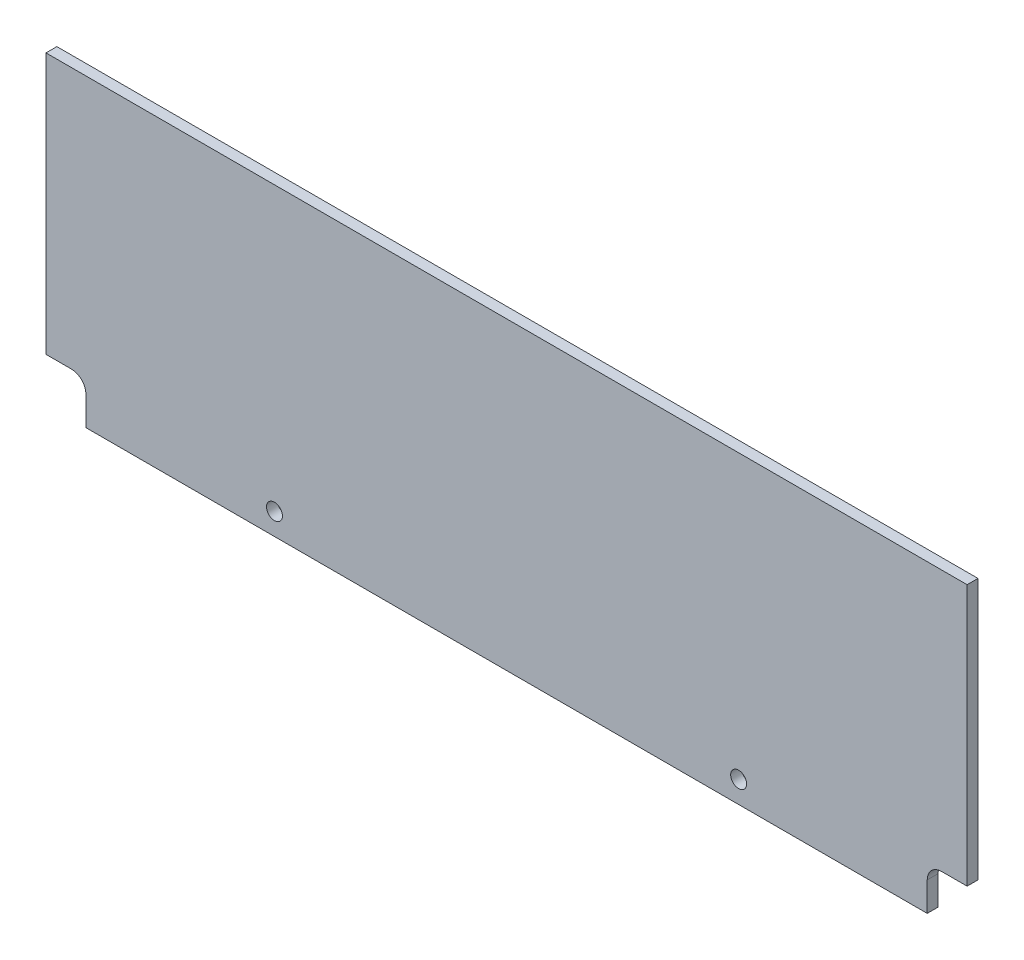
ISO-10303-21;
HEADER;
FILE_DESCRIPTION(('STEP AP214'),'2;1');
FILE_NAME('part.step','',(''),(''),'','','');
FILE_SCHEMA(('AUTOMOTIVE_DESIGN { 1 0 10303 214 1 1 1 1 }'));
ENDSEC;
DATA;
#1=APPLICATION_CONTEXT('core data for automotive mechanical design processes');
#2=APPLICATION_PROTOCOL_DEFINITION('international standard','automotive_design',2000,#1);
#3=PRODUCT_CONTEXT('',#1,'mechanical');
#4=PRODUCT('Part','Part','',(#3));
#5=PRODUCT_RELATED_PRODUCT_CATEGORY('part','',(#4));
#6=PRODUCT_DEFINITION_FORMATION('','',#4);
#7=PRODUCT_DEFINITION_CONTEXT('part definition',#1,'design');
#8=PRODUCT_DEFINITION('design','',#6,#7);
#9=PRODUCT_DEFINITION_SHAPE('','',#8);
#10=(LENGTH_UNIT() NAMED_UNIT(*) SI_UNIT(.MILLI.,.METRE.));
#11=(NAMED_UNIT(*) PLANE_ANGLE_UNIT() SI_UNIT($,.RADIAN.));
#12=(NAMED_UNIT(*) SI_UNIT($,.STERADIAN.) SOLID_ANGLE_UNIT());
#13=UNCERTAINTY_MEASURE_WITH_UNIT(LENGTH_MEASURE(1.E-05),#10,'distance_accuracy_value','');
#14=(GEOMETRIC_REPRESENTATION_CONTEXT(3) GLOBAL_UNCERTAINTY_ASSIGNED_CONTEXT((#13)) GLOBAL_UNIT_ASSIGNED_CONTEXT((#10,
#11,#12)) REPRESENTATION_CONTEXT('',''));
#15=CARTESIAN_POINT('',(0.,0.,0.));
#16=DIRECTION('',(0.,0.,1.));
#17=DIRECTION('',(1.,0.,0.));
#18=AXIS2_PLACEMENT_3D('',#15,#16,#17);
#19=CARTESIAN_POINT('',(-120.,24.,0.));
#20=DIRECTION('',(0.,0.,-1.));
#21=DIRECTION('',(1.,0.,0.));
#22=AXIS2_PLACEMENT_3D('',#19,#20,#21);
#23=CYLINDRICAL_SURFACE('',#22,4.);
#24=DIRECTION('',(0.,0.,1.));
#25=VECTOR('',#24,1.);
#26=CARTESIAN_POINT('',(-116.,24.,0.));
#27=LINE('',#26,#25);
#28=CARTESIAN_POINT('',(-116.,24.,0.));
#29=VERTEX_POINT('',#28);
#30=CARTESIAN_POINT('',(-116.,24.,3.));
#31=VERTEX_POINT('',#30);
#32=EDGE_CURVE('E203',#29,#31,#27,.T.);
#33=ORIENTED_EDGE('',*,*,#32,.T.);
#34=CARTESIAN_POINT('',(-120.,24.,3.));
#35=DIRECTION('',(0.,0.,1.));
#36=DIRECTION('',(1.,0.,0.));
#37=AXIS2_PLACEMENT_3D('',#34,#35,#36);
#38=CIRCLE('',#37,4.);
#39=CARTESIAN_POINT('',(-120.,28.,3.));
#40=VERTEX_POINT('',#39);
#41=EDGE_CURVE('E141',#31,#40,#38,.T.);
#42=ORIENTED_EDGE('',*,*,#41,.T.);
#43=DIRECTION('',(0.,0.,1.));
#44=VECTOR('',#43,1.);
#45=CARTESIAN_POINT('',(-120.,28.,0.));
#46=LINE('',#45,#44);
#47=CARTESIAN_POINT('',(-120.,28.,0.));
#48=VERTEX_POINT('',#47);
#49=EDGE_CURVE('E11',#48,#40,#46,.T.);
#50=ORIENTED_EDGE('',*,*,#49,.F.);
#51=CARTESIAN_POINT('',(-120.,24.,0.));
#52=DIRECTION('',(0.,0.,1.));
#53=DIRECTION('',(1.,0.,0.));
#54=AXIS2_PLACEMENT_3D('',#51,#52,#53);
#55=CIRCLE('',#54,4.);
#56=EDGE_CURVE('E148',#29,#48,#55,.T.);
#57=ORIENTED_EDGE('',*,*,#56,.F.);
#58=EDGE_LOOP('',(#33,#42,#50,#57));
#59=FACE_BOUND('',#58,.T.);
#60=ADVANCED_FACE('F17',(#59),#23,.F.);
#61=CARTESIAN_POINT('',(-120.,28.,0.));
#62=DIRECTION('',(0.,-1.,0.));
#63=DIRECTION('',(0.,0.,-1.));
#64=AXIS2_PLACEMENT_3D('',#61,#62,#63);
#65=PLANE('',#64);
#66=ORIENTED_EDGE('',*,*,#49,.T.);
#67=DIRECTION('',(-1.,0.,0.));
#68=VECTOR('',#67,1.);
#69=CARTESIAN_POINT('',(-120.,28.,3.));
#70=LINE('',#69,#68);
#71=CARTESIAN_POINT('',(-127.,28.,3.));
#72=VERTEX_POINT('',#71);
#73=EDGE_CURVE('E151',#40,#72,#70,.T.);
#74=ORIENTED_EDGE('',*,*,#73,.T.);
#75=DIRECTION('',(0.,0.,1.));
#76=VECTOR('',#75,1.);
#77=CARTESIAN_POINT('',(-127.,28.,0.));
#78=LINE('',#77,#76);
#79=CARTESIAN_POINT('',(-127.,28.,0.));
#80=VERTEX_POINT('',#79);
#81=EDGE_CURVE('E26',#80,#72,#78,.T.);
#82=ORIENTED_EDGE('',*,*,#81,.F.);
#83=DIRECTION('',(-1.,0.,0.));
#84=VECTOR('',#83,1.);
#85=CARTESIAN_POINT('',(-120.,28.,0.));
#86=LINE('',#85,#84);
#87=EDGE_CURVE('E160',#48,#80,#86,.T.);
#88=ORIENTED_EDGE('',*,*,#87,.F.);
#89=EDGE_LOOP('',(#66,#74,#82,#88));
#90=FACE_BOUND('',#89,.T.);
#91=ADVANCED_FACE('F19',(#90),#65,.T.);
#92=CARTESIAN_POINT('',(-127.,28.,0.));
#93=DIRECTION('',(-1.,0.,0.));
#94=DIRECTION('',(0.,0.,1.));
#95=AXIS2_PLACEMENT_3D('',#92,#93,#94);
#96=PLANE('',#95);
#97=ORIENTED_EDGE('',*,*,#81,.T.);
#98=DIRECTION('',(0.,1.,0.));
#99=VECTOR('',#98,1.);
#100=CARTESIAN_POINT('',(-127.,28.,3.));
#101=LINE('',#100,#99);
#102=CARTESIAN_POINT('',(-127.,100.,3.));
#103=VERTEX_POINT('',#102);
#104=EDGE_CURVE('E224',#72,#103,#101,.T.);
#105=ORIENTED_EDGE('',*,*,#104,.T.);
#106=DIRECTION('',(0.,0.,1.));
#107=VECTOR('',#106,1.);
#108=CARTESIAN_POINT('',(-127.,100.,0.));
#109=LINE('',#108,#107);
#110=CARTESIAN_POINT('',(-127.,100.,0.));
#111=VERTEX_POINT('',#110);
#112=EDGE_CURVE('E171',#111,#103,#109,.T.);
#113=ORIENTED_EDGE('',*,*,#112,.F.);
#114=DIRECTION('',(0.,1.,0.));
#115=VECTOR('',#114,1.);
#116=CARTESIAN_POINT('',(-127.,28.,0.));
#117=LINE('',#116,#115);
#118=EDGE_CURVE('E164',#80,#111,#117,.T.);
#119=ORIENTED_EDGE('',*,*,#118,.F.);
#120=EDGE_LOOP('',(#97,#105,#113,#119));
#121=FACE_BOUND('',#120,.T.);
#122=ADVANCED_FACE('F225',(#121),#96,.T.);
#123=CARTESIAN_POINT('',(-127.,100.,0.));
#124=DIRECTION('',(0.,1.,0.));
#125=DIRECTION('',(1.,0.,0.));
#126=AXIS2_PLACEMENT_3D('',#123,#124,#125);
#127=PLANE('',#126);
#128=ORIENTED_EDGE('',*,*,#112,.T.);
#129=DIRECTION('',(1.,0.,0.));
#130=VECTOR('',#129,1.);
#131=CARTESIAN_POINT('',(-127.,100.,3.));
#132=LINE('',#131,#130);
#133=CARTESIAN_POINT('',(127.,100.,3.));
#134=VERTEX_POINT('',#133);
#135=EDGE_CURVE('E154',#103,#134,#132,.T.);
#136=ORIENTED_EDGE('',*,*,#135,.T.);
#137=DIRECTION('',(0.,0.,1.));
#138=VECTOR('',#137,1.);
#139=CARTESIAN_POINT('',(127.,100.,0.));
#140=LINE('',#139,#138);
#141=CARTESIAN_POINT('',(127.,100.,0.));
#142=VERTEX_POINT('',#141);
#143=EDGE_CURVE('E180',#142,#134,#140,.T.);
#144=ORIENTED_EDGE('',*,*,#143,.F.);
#145=DIRECTION('',(1.,0.,0.));
#146=VECTOR('',#145,1.);
#147=CARTESIAN_POINT('',(-127.,100.,0.));
#148=LINE('',#147,#146);
#149=EDGE_CURVE('E168',#111,#142,#148,.T.);
#150=ORIENTED_EDGE('',*,*,#149,.F.);
#151=EDGE_LOOP('',(#128,#136,#144,#150));
#152=FACE_BOUND('',#151,.T.);
#153=ADVANCED_FACE('F218',(#152),#127,.T.);
#154=CARTESIAN_POINT('',(127.,100.,0.));
#155=DIRECTION('',(1.,0.,0.));
#156=DIRECTION('',(0.,1.,0.));
#157=AXIS2_PLACEMENT_3D('',#154,#155,#156);
#158=PLANE('',#157);
#159=ORIENTED_EDGE('',*,*,#143,.T.);
#160=DIRECTION('',(0.,-1.,0.));
#161=VECTOR('',#160,1.);
#162=CARTESIAN_POINT('',(127.,100.,3.));
#163=LINE('',#162,#161);
#164=CARTESIAN_POINT('',(127.,28.,3.));
#165=VERTEX_POINT('',#164);
#166=EDGE_CURVE('E235',#134,#165,#163,.T.);
#167=ORIENTED_EDGE('',*,*,#166,.T.);
#168=DIRECTION('',(0.,0.,1.));
#169=VECTOR('',#168,1.);
#170=CARTESIAN_POINT('',(127.,28.,0.));
#171=LINE('',#170,#169);
#172=CARTESIAN_POINT('',(127.,28.,0.));
#173=VERTEX_POINT('',#172);
#174=EDGE_CURVE('E183',#173,#165,#171,.T.);
#175=ORIENTED_EDGE('',*,*,#174,.F.);
#176=DIRECTION('',(0.,-1.,0.));
#177=VECTOR('',#176,1.);
#178=CARTESIAN_POINT('',(127.,100.,0.));
#179=LINE('',#178,#177);
#180=EDGE_CURVE('E175',#142,#173,#179,.T.);
#181=ORIENTED_EDGE('',*,*,#180,.F.);
#182=EDGE_LOOP('',(#159,#167,#175,#181));
#183=FACE_BOUND('',#182,.T.);
#184=ADVANCED_FACE('F289',(#183),#158,.T.);
#185=CARTESIAN_POINT('',(-120.,28.,0.));
#186=DIRECTION('',(0.,-1.,0.));
#187=DIRECTION('',(0.,0.,-1.));
#188=AXIS2_PLACEMENT_3D('',#185,#186,#187);
#189=PLANE('',#188);
#190=DIRECTION('',(1.,0.,0.));
#191=VECTOR('',#190,1.);
#192=CARTESIAN_POINT('',(-120.,28.,0.));
#193=LINE('',#192,#191);
#194=CARTESIAN_POINT('',(120.,28.,0.));
#195=VERTEX_POINT('',#194);
#196=EDGE_CURVE('E179',#195,#173,#193,.T.);
#197=ORIENTED_EDGE('',*,*,#196,.T.);
#198=ORIENTED_EDGE('',*,*,#174,.T.);
#199=DIRECTION('',(1.,0.,0.));
#200=VECTOR('',#199,1.);
#201=CARTESIAN_POINT('',(0.,28.,3.));
#202=LINE('',#201,#200);
#203=CARTESIAN_POINT('',(120.,28.,3.));
#204=VERTEX_POINT('',#203);
#205=EDGE_CURVE('E240',#204,#165,#202,.T.);
#206=ORIENTED_EDGE('',*,*,#205,.F.);
#207=DIRECTION('',(0.,0.,1.));
#208=VECTOR('',#207,1.);
#209=CARTESIAN_POINT('',(120.,28.,0.));
#210=LINE('',#209,#208);
#211=EDGE_CURVE('E207',#195,#204,#210,.T.);
#212=ORIENTED_EDGE('',*,*,#211,.F.);
#213=EDGE_LOOP('',(#197,#198,#206,#212));
#214=FACE_BOUND('',#213,.T.);
#215=ADVANCED_FACE('F288',(#214),#189,.T.);
#216=CARTESIAN_POINT('',(120.,24.,0.));
#217=DIRECTION('',(0.,0.,-1.));
#218=DIRECTION('',(1.,0.,0.));
#219=AXIS2_PLACEMENT_3D('',#216,#217,#218);
#220=CYLINDRICAL_SURFACE('',#219,4.);
#221=ORIENTED_EDGE('',*,*,#211,.T.);
#222=CARTESIAN_POINT('',(120.,24.,3.));
#223=DIRECTION('',(0.,0.,1.));
#224=DIRECTION('',(1.,0.,0.));
#225=AXIS2_PLACEMENT_3D('',#222,#223,#224);
#226=CIRCLE('',#225,4.);
#227=CARTESIAN_POINT('',(116.,24.,3.));
#228=VERTEX_POINT('',#227);
#229=EDGE_CURVE('E246',#204,#228,#226,.T.);
#230=ORIENTED_EDGE('',*,*,#229,.T.);
#231=DIRECTION('',(0.,0.,1.));
#232=VECTOR('',#231,1.);
#233=CARTESIAN_POINT('',(116.,24.,0.));
#234=LINE('',#233,#232);
#235=CARTESIAN_POINT('',(116.,24.,0.));
#236=VERTEX_POINT('',#235);
#237=EDGE_CURVE('E206',#236,#228,#234,.T.);
#238=ORIENTED_EDGE('',*,*,#237,.F.);
#239=CARTESIAN_POINT('',(120.,24.,0.));
#240=DIRECTION('',(0.,0.,1.));
#241=DIRECTION('',(1.,0.,0.));
#242=AXIS2_PLACEMENT_3D('',#239,#240,#241);
#243=CIRCLE('',#242,4.);
#244=EDGE_CURVE('E187',#195,#236,#243,.T.);
#245=ORIENTED_EDGE('',*,*,#244,.F.);
#246=EDGE_LOOP('',(#221,#230,#238,#245));
#247=FACE_BOUND('',#246,.T.);
#248=ADVANCED_FACE('F278',(#247),#220,.F.);
#249=CARTESIAN_POINT('',(116.,24.,0.));
#250=DIRECTION('',(1.,0.,0.));
#251=DIRECTION('',(0.,1.,0.));
#252=AXIS2_PLACEMENT_3D('',#249,#250,#251);
#253=PLANE('',#252);
#254=ORIENTED_EDGE('',*,*,#237,.T.);
#255=DIRECTION('',(0.,-1.,0.));
#256=VECTOR('',#255,1.);
#257=CARTESIAN_POINT('',(116.,24.,3.));
#258=LINE('',#257,#256);
#259=CARTESIAN_POINT('',(116.,16.,3.));
#260=VERTEX_POINT('',#259);
#261=EDGE_CURVE('E249',#228,#260,#258,.T.);
#262=ORIENTED_EDGE('',*,*,#261,.T.);
#263=DIRECTION('',(0.,0.,1.));
#264=VECTOR('',#263,1.);
#265=CARTESIAN_POINT('',(116.,16.,0.));
#266=LINE('',#265,#264);
#267=CARTESIAN_POINT('',(116.,16.,0.));
#268=VERTEX_POINT('',#267);
#269=EDGE_CURVE('E48',#268,#260,#266,.T.);
#270=ORIENTED_EDGE('',*,*,#269,.F.);
#271=DIRECTION('',(0.,-1.,0.));
#272=VECTOR('',#271,1.);
#273=CARTESIAN_POINT('',(116.,24.,0.));
#274=LINE('',#273,#272);
#275=EDGE_CURVE('E191',#236,#268,#274,.T.);
#276=ORIENTED_EDGE('',*,*,#275,.F.);
#277=EDGE_LOOP('',(#254,#262,#270,#276));
#278=FACE_BOUND('',#277,.T.);
#279=ADVANCED_FACE('F281',(#278),#253,.T.);
#280=CARTESIAN_POINT('',(-116.,16.,0.));
#281=DIRECTION('',(0.,1.,0.));
#282=DIRECTION('',(1.,0.,0.));
#283=AXIS2_PLACEMENT_3D('',#280,#281,#282);
#284=PLANE('',#283);
#285=DIRECTION('',(1.,0.,0.));
#286=VECTOR('',#285,1.);
#287=CARTESIAN_POINT('',(-116.,16.,0.));
#288=LINE('',#287,#286);
#289=CARTESIAN_POINT('',(-116.,16.,0.));
#290=VERTEX_POINT('',#289);
#291=EDGE_CURVE('E195',#290,#268,#288,.T.);
#292=ORIENTED_EDGE('',*,*,#291,.T.);
#293=ORIENTED_EDGE('',*,*,#269,.T.);
#294=DIRECTION('',(1.,0.,0.));
#295=VECTOR('',#294,1.);
#296=CARTESIAN_POINT('',(-116.,16.,3.));
#297=LINE('',#296,#295);
#298=CARTESIAN_POINT('',(-116.,16.,3.));
#299=VERTEX_POINT('',#298);
#300=EDGE_CURVE('E252',#299,#260,#297,.T.);
#301=ORIENTED_EDGE('',*,*,#300,.F.);
#302=DIRECTION('',(0.,0.,1.));
#303=VECTOR('',#302,1.);
#304=CARTESIAN_POINT('',(-116.,16.,0.));
#305=LINE('',#304,#303);
#306=EDGE_CURVE('E38',#290,#299,#305,.T.);
#307=ORIENTED_EDGE('',*,*,#306,.F.);
#308=EDGE_LOOP('',(#292,#293,#301,#307));
#309=FACE_BOUND('',#308,.T.);
#310=ADVANCED_FACE('F299',(#309),#284,.F.);
#311=CARTESIAN_POINT('',(-116.,24.,0.));
#312=DIRECTION('',(1.,0.,0.));
#313=DIRECTION('',(0.,1.,0.));
#314=AXIS2_PLACEMENT_3D('',#311,#312,#313);
#315=PLANE('',#314);
#316=DIRECTION('',(0.,-1.,0.));
#317=VECTOR('',#316,1.);
#318=CARTESIAN_POINT('',(-116.,24.,0.));
#319=LINE('',#318,#317);
#320=EDGE_CURVE('E198',#29,#290,#319,.T.);
#321=ORIENTED_EDGE('',*,*,#320,.T.);
#322=ORIENTED_EDGE('',*,*,#306,.T.);
#323=DIRECTION('',(0.,-1.,0.));
#324=VECTOR('',#323,1.);
#325=CARTESIAN_POINT('',(-116.,24.,3.));
#326=LINE('',#325,#324);
#327=EDGE_CURVE('E258',#31,#299,#326,.T.);
#328=ORIENTED_EDGE('',*,*,#327,.F.);
#329=ORIENTED_EDGE('',*,*,#32,.F.);
#330=EDGE_LOOP('',(#321,#322,#328,#329));
#331=FACE_BOUND('',#330,.T.);
#332=ADVANCED_FACE('F298',(#331),#315,.F.);
#333=CARTESIAN_POINT('',(-64.,22.,0.));
#334=DIRECTION('',(0.,0.,-1.));
#335=DIRECTION('',(1.,0.,0.));
#336=AXIS2_PLACEMENT_3D('',#333,#334,#335);
#337=CYLINDRICAL_SURFACE('',#336,2.2);
#338=CARTESIAN_POINT('',(-64.,22.,0.));
#339=DIRECTION('',(0.,0.,1.));
#340=DIRECTION('',(1.,0.,0.));
#341=AXIS2_PLACEMENT_3D('',#338,#339,#340);
#342=CIRCLE('',#341,2.2);
#343=CARTESIAN_POINT('',(-61.8,22.,0.));
#344=VERTEX_POINT('',#343);
#345=EDGE_CURVE('E140',#344,#344,#342,.T.);
#346=ORIENTED_EDGE('',*,*,#345,.F.);
#347=EDGE_LOOP('',(#346));
#348=FACE_BOUND('',#347,.T.);
#349=CARTESIAN_POINT('',(-64.,22.,3.));
#350=DIRECTION('',(0.,0.,1.));
#351=DIRECTION('',(1.,0.,0.));
#352=AXIS2_PLACEMENT_3D('',#349,#350,#351);
#353=CIRCLE('',#352,2.2);
#354=CARTESIAN_POINT('',(-61.8,22.,3.));
#355=VERTEX_POINT('',#354);
#356=EDGE_CURVE('E263',#355,#355,#353,.T.);
#357=ORIENTED_EDGE('',*,*,#356,.T.);
#358=EDGE_LOOP('',(#357));
#359=FACE_BOUND('',#358,.T.);
#360=ADVANCED_FACE('F333',(#348,#359),#337,.F.);
#361=CARTESIAN_POINT('',(64.,22.,0.));
#362=DIRECTION('',(0.,0.,-1.));
#363=DIRECTION('',(1.,0.,0.));
#364=AXIS2_PLACEMENT_3D('',#361,#362,#363);
#365=CYLINDRICAL_SURFACE('',#364,2.2);
#366=CARTESIAN_POINT('',(64.,22.,0.));
#367=DIRECTION('',(0.,0.,1.));
#368=DIRECTION('',(1.,0.,0.));
#369=AXIS2_PLACEMENT_3D('',#366,#367,#368);
#370=CIRCLE('',#369,2.2);
#371=CARTESIAN_POINT('',(66.2,22.,0.));
#372=VERTEX_POINT('',#371);
#373=EDGE_CURVE('E136',#372,#372,#370,.T.);
#374=ORIENTED_EDGE('',*,*,#373,.F.);
#375=EDGE_LOOP('',(#374));
#376=FACE_BOUND('',#375,.T.);
#377=CARTESIAN_POINT('',(64.,22.,3.));
#378=DIRECTION('',(0.,0.,1.));
#379=DIRECTION('',(1.,0.,0.));
#380=AXIS2_PLACEMENT_3D('',#377,#378,#379);
#381=CIRCLE('',#380,2.2);
#382=CARTESIAN_POINT('',(66.2,22.,3.));
#383=VERTEX_POINT('',#382);
#384=EDGE_CURVE('E266',#383,#383,#381,.T.);
#385=ORIENTED_EDGE('',*,*,#384,.T.);
#386=EDGE_LOOP('',(#385));
#387=FACE_BOUND('',#386,.T.);
#388=ADVANCED_FACE('F330',(#376,#387),#365,.F.);
#389=CARTESIAN_POINT('',(0.,57.34623543788,0.));
#390=DIRECTION('',(0.,0.,1.));
#391=DIRECTION('',(1.,0.,0.));
#392=AXIS2_PLACEMENT_3D('',#389,#390,#391);
#393=PLANE('',#392);
#394=ORIENTED_EDGE('',*,*,#56,.T.);
#395=ORIENTED_EDGE('',*,*,#87,.T.);
#396=ORIENTED_EDGE('',*,*,#118,.T.);
#397=ORIENTED_EDGE('',*,*,#149,.T.);
#398=ORIENTED_EDGE('',*,*,#180,.T.);
#399=ORIENTED_EDGE('',*,*,#196,.F.);
#400=ORIENTED_EDGE('',*,*,#244,.T.);
#401=ORIENTED_EDGE('',*,*,#275,.T.);
#402=ORIENTED_EDGE('',*,*,#291,.F.);
#403=ORIENTED_EDGE('',*,*,#320,.F.);
#404=EDGE_LOOP('',(#394,#395,#396,#397,#398,#399,#400,#401,#402,#403));
#405=FACE_BOUND('',#404,.T.);
#406=ORIENTED_EDGE('',*,*,#345,.T.);
#407=EDGE_LOOP('',(#406));
#408=FACE_BOUND('',#407,.T.);
#409=ORIENTED_EDGE('',*,*,#373,.T.);
#410=EDGE_LOOP('',(#409));
#411=FACE_BOUND('',#410,.T.);
#412=ADVANCED_FACE('F137',(#405,#408,#411),#393,.F.);
#413=CARTESIAN_POINT('',(0.,57.34623543788,3.));
#414=DIRECTION('',(0.,0.,1.));
#415=DIRECTION('',(1.,0.,0.));
#416=AXIS2_PLACEMENT_3D('',#413,#414,#415);
#417=PLANE('',#416);
#418=ORIENTED_EDGE('',*,*,#327,.T.);
#419=ORIENTED_EDGE('',*,*,#300,.T.);
#420=ORIENTED_EDGE('',*,*,#261,.F.);
#421=ORIENTED_EDGE('',*,*,#229,.F.);
#422=ORIENTED_EDGE('',*,*,#205,.T.);
#423=ORIENTED_EDGE('',*,*,#166,.F.);
#424=ORIENTED_EDGE('',*,*,#135,.F.);
#425=ORIENTED_EDGE('',*,*,#104,.F.);
#426=ORIENTED_EDGE('',*,*,#73,.F.);
#427=ORIENTED_EDGE('',*,*,#41,.F.);
#428=EDGE_LOOP('',(#418,#419,#420,#421,#422,#423,#424,#425,#426,#427));
#429=FACE_BOUND('',#428,.T.);
#430=ORIENTED_EDGE('',*,*,#356,.F.);
#431=EDGE_LOOP('',(#430));
#432=FACE_BOUND('',#431,.T.);
#433=ORIENTED_EDGE('',*,*,#384,.F.);
#434=EDGE_LOOP('',(#433));
#435=FACE_BOUND('',#434,.T.);
#436=ADVANCED_FACE('F231',(#429,#432,#435),#417,.T.);
#437=CLOSED_SHELL('',(#60,#91,#122,#153,#184,#215,#248,#279,#310,#332,#360,#388,#412,#436));
#438=MANIFOLD_SOLID_BREP('B1',#437);
#439=ADVANCED_BREP_SHAPE_REPRESENTATION('',(#18,#438),#14);
#440=SHAPE_DEFINITION_REPRESENTATION(#9,#439);
ENDSEC;
END-ISO-10303-21;
